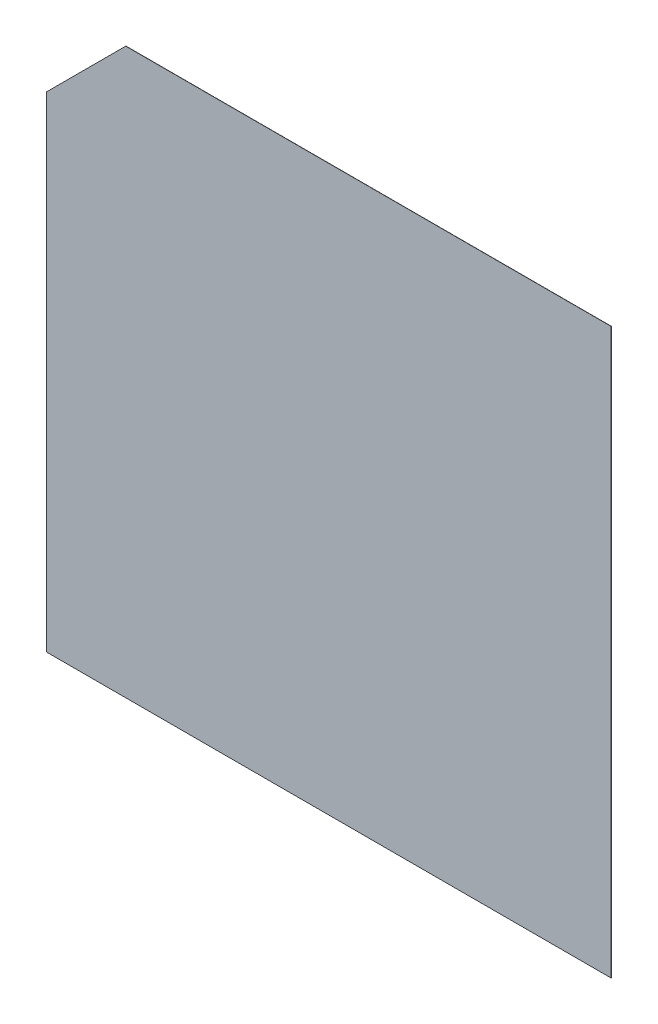
ISO-10303-21;
HEADER;
FILE_DESCRIPTION(('STEP AP214'),'2;1');
FILE_NAME('part.step','',(''),(''),'','','');
FILE_SCHEMA(('AUTOMOTIVE_DESIGN { 1 0 10303 214 1 1 1 1 }'));
ENDSEC;
DATA;
#1=APPLICATION_CONTEXT('core data for automotive mechanical design processes');
#2=APPLICATION_PROTOCOL_DEFINITION('international standard','automotive_design',2000,#1);
#3=PRODUCT_CONTEXT('',#1,'mechanical');
#4=PRODUCT('Part','Part','',(#3));
#5=PRODUCT_RELATED_PRODUCT_CATEGORY('part','',(#4));
#6=PRODUCT_DEFINITION_FORMATION('','',#4);
#7=PRODUCT_DEFINITION_CONTEXT('part definition',#1,'design');
#8=PRODUCT_DEFINITION('design','',#6,#7);
#9=PRODUCT_DEFINITION_SHAPE('','',#8);
#10=(LENGTH_UNIT() NAMED_UNIT(*) SI_UNIT(.MILLI.,.METRE.));
#11=(NAMED_UNIT(*) PLANE_ANGLE_UNIT() SI_UNIT($,.RADIAN.));
#12=(NAMED_UNIT(*) SI_UNIT($,.STERADIAN.) SOLID_ANGLE_UNIT());
#13=UNCERTAINTY_MEASURE_WITH_UNIT(LENGTH_MEASURE(1.E-05),#10,'distance_accuracy_value','');
#14=(GEOMETRIC_REPRESENTATION_CONTEXT(3) GLOBAL_UNCERTAINTY_ASSIGNED_CONTEXT((#13)) GLOBAL_UNIT_ASSIGNED_CONTEXT((#10,
#11,#12)) REPRESENTATION_CONTEXT('',''));
#15=CARTESIAN_POINT('',(0.,0.,0.));
#16=DIRECTION('',(0.,0.,1.));
#17=DIRECTION('',(1.,0.,0.));
#18=AXIS2_PLACEMENT_3D('',#15,#16,#17);
#19=CARTESIAN_POINT('',(0.,0.,0.001));
#20=DIRECTION('',(0.,0.,-1.));
#21=DIRECTION('',(-1.,0.,0.));
#22=AXIS2_PLACEMENT_3D('',#19,#20,#21);
#23=PLANE('',#22);
#24=DIRECTION('',(0.,1.,0.));
#25=VECTOR('',#24,1.);
#26=CARTESIAN_POINT('',(2.5,0.,0.001));
#27=LINE('',#26,#25);
#28=CARTESIAN_POINT('',(2.5,0.,0.001));
#29=VERTEX_POINT('',#28);
#30=CARTESIAN_POINT('',(2.5,2.5,0.001));
#31=VERTEX_POINT('',#30);
#32=EDGE_CURVE('E84',#29,#31,#27,.T.);
#33=ORIENTED_EDGE('',*,*,#32,.T.);
#34=DIRECTION('',(1.,0.,0.));
#35=VECTOR('',#34,1.);
#36=CARTESIAN_POINT('',(2.5,2.5,0.001));
#37=LINE('',#36,#35);
#38=CARTESIAN_POINT('',(0.35,2.5,0.001));
#39=VERTEX_POINT('',#38);
#40=EDGE_CURVE('E65',#31,#39,#37,.F.);
#41=ORIENTED_EDGE('',*,*,#40,.T.);
#42=DIRECTION('',(0.707106781186548,0.707106781186548,0.));
#43=VECTOR('',#42,1.);
#44=CARTESIAN_POINT('',(0.35,2.5,0.001));
#45=LINE('',#44,#43);
#46=CARTESIAN_POINT('',(0.,2.15,0.001));
#47=VERTEX_POINT('',#46);
#48=EDGE_CURVE('E59',#39,#47,#45,.F.);
#49=ORIENTED_EDGE('',*,*,#48,.T.);
#50=DIRECTION('',(0.,1.,0.));
#51=VECTOR('',#50,1.);
#52=CARTESIAN_POINT('',(0.,2.15,0.001));
#53=LINE('',#52,#51);
#54=CARTESIAN_POINT('',(0.,0.,0.001));
#55=VERTEX_POINT('',#54);
#56=EDGE_CURVE('E62',#47,#55,#53,.F.);
#57=ORIENTED_EDGE('',*,*,#56,.T.);
#58=DIRECTION('',(1.,0.,0.));
#59=VECTOR('',#58,1.);
#60=CARTESIAN_POINT('',(0.,0.,0.001));
#61=LINE('',#60,#59);
#62=EDGE_CURVE('E92',#55,#29,#61,.T.);
#63=ORIENTED_EDGE('',*,*,#62,.T.);
#64=EDGE_LOOP('',(#33,#41,#49,#57,#63));
#65=FACE_BOUND('',#64,.T.);
#66=ADVANCED_FACE('F16',(#65),#23,.F.);
#67=CARTESIAN_POINT('',(0.,2.15,0.));
#68=DIRECTION('',(1.,0.,0.));
#69=DIRECTION('',(0.,0.,-1.));
#70=AXIS2_PLACEMENT_3D('',#67,#68,#69);
#71=PLANE('',#70);
#72=DIRECTION('',(0.,0.,-1.));
#73=VECTOR('',#72,1.);
#74=CARTESIAN_POINT('',(0.,0.,0.));
#75=LINE('',#74,#73);
#76=CARTESIAN_POINT('',(0.,0.,0.));
#77=VERTEX_POINT('',#76);
#78=EDGE_CURVE('E75',#77,#55,#75,.F.);
#79=ORIENTED_EDGE('',*,*,#78,.T.);
#80=ORIENTED_EDGE('',*,*,#56,.F.);
#81=DIRECTION('',(0.,0.,-1.));
#82=VECTOR('',#81,1.);
#83=CARTESIAN_POINT('',(0.,2.15,0.));
#84=LINE('',#83,#82);
#85=CARTESIAN_POINT('',(0.,2.15,0.));
#86=VERTEX_POINT('',#85);
#87=EDGE_CURVE('E19',#47,#86,#84,.T.);
#88=ORIENTED_EDGE('',*,*,#87,.T.);
#89=DIRECTION('',(0.,1.,0.));
#90=VECTOR('',#89,1.);
#91=CARTESIAN_POINT('',(0.,0.,0.));
#92=LINE('',#91,#90);
#93=EDGE_CURVE('E89',#77,#86,#92,.T.);
#94=ORIENTED_EDGE('',*,*,#93,.F.);
#95=EDGE_LOOP('',(#79,#80,#88,#94));
#96=FACE_BOUND('',#95,.T.);
#97=ADVANCED_FACE('F72',(#96),#71,.F.);
#98=CARTESIAN_POINT('',(0.35,2.5,0.));
#99=DIRECTION('',(0.707106781186548,-0.707106781186548,0.));
#100=DIRECTION('',(0.707106781186548,0.707106781186548,0.));
#101=AXIS2_PLACEMENT_3D('',#98,#99,#100);
#102=PLANE('',#101);
#103=ORIENTED_EDGE('',*,*,#87,.F.);
#104=ORIENTED_EDGE('',*,*,#48,.F.);
#105=DIRECTION('',(0.,0.,1.));
#106=VECTOR('',#105,1.);
#107=CARTESIAN_POINT('',(0.35,2.5,0.));
#108=LINE('',#107,#106);
#109=CARTESIAN_POINT('',(0.35,2.5,0.));
#110=VERTEX_POINT('',#109);
#111=EDGE_CURVE('E82',#39,#110,#108,.F.);
#112=ORIENTED_EDGE('',*,*,#111,.T.);
#113=DIRECTION('',(0.707106781186547,0.707106781186548,0.));
#114=VECTOR('',#113,1.);
#115=CARTESIAN_POINT('',(0.,2.15,0.));
#116=LINE('',#115,#114);
#117=EDGE_CURVE('E80',#86,#110,#116,.T.);
#118=ORIENTED_EDGE('',*,*,#117,.F.);
#119=EDGE_LOOP('',(#103,#104,#112,#118));
#120=FACE_BOUND('',#119,.T.);
#121=ADVANCED_FACE('F78',(#120),#102,.F.);
#122=CARTESIAN_POINT('',(2.5,2.5,0.));
#123=DIRECTION('',(0.,-1.,0.));
#124=DIRECTION('',(0.,0.,-1.));
#125=AXIS2_PLACEMENT_3D('',#122,#123,#124);
#126=PLANE('',#125);
#127=ORIENTED_EDGE('',*,*,#111,.F.);
#128=ORIENTED_EDGE('',*,*,#40,.F.);
#129=DIRECTION('',(0.,0.,-1.));
#130=VECTOR('',#129,1.);
#131=CARTESIAN_POINT('',(2.5,2.5,0.));
#132=LINE('',#131,#130);
#133=CARTESIAN_POINT('',(2.5,2.5,0.));
#134=VERTEX_POINT('',#133);
#135=EDGE_CURVE('E94',#31,#134,#132,.T.);
#136=ORIENTED_EDGE('',*,*,#135,.T.);
#137=DIRECTION('',(-1.,0.,0.));
#138=VECTOR('',#137,1.);
#139=CARTESIAN_POINT('',(0.,2.5,0.));
#140=LINE('',#139,#138);
#141=EDGE_CURVE('E87',#110,#134,#140,.F.);
#142=ORIENTED_EDGE('',*,*,#141,.F.);
#143=EDGE_LOOP('',(#127,#128,#136,#142));
#144=FACE_BOUND('',#143,.T.);
#145=ADVANCED_FACE('F108',(#144),#126,.F.);
#146=CARTESIAN_POINT('',(2.5,0.,0.));
#147=DIRECTION('',(-1.,0.,0.));
#148=DIRECTION('',(0.,0.,1.));
#149=AXIS2_PLACEMENT_3D('',#146,#147,#148);
#150=PLANE('',#149);
#151=ORIENTED_EDGE('',*,*,#135,.F.);
#152=ORIENTED_EDGE('',*,*,#32,.F.);
#153=DIRECTION('',(0.,0.,1.));
#154=VECTOR('',#153,1.);
#155=CARTESIAN_POINT('',(2.5,0.,0.));
#156=LINE('',#155,#154);
#157=CARTESIAN_POINT('',(2.5,0.,0.));
#158=VERTEX_POINT('',#157);
#159=EDGE_CURVE('E34',#29,#158,#156,.F.);
#160=ORIENTED_EDGE('',*,*,#159,.T.);
#161=DIRECTION('',(0.,1.,0.));
#162=VECTOR('',#161,1.);
#163=CARTESIAN_POINT('',(2.5,0.,0.));
#164=LINE('',#163,#162);
#165=EDGE_CURVE('E25',#134,#158,#164,.F.);
#166=ORIENTED_EDGE('',*,*,#165,.F.);
#167=EDGE_LOOP('',(#151,#152,#160,#166));
#168=FACE_BOUND('',#167,.T.);
#169=ADVANCED_FACE('F103',(#168),#150,.F.);
#170=CARTESIAN_POINT('',(0.,0.,0.));
#171=DIRECTION('',(0.,1.,0.));
#172=DIRECTION('',(0.,0.,1.));
#173=AXIS2_PLACEMENT_3D('',#170,#171,#172);
#174=PLANE('',#173);
#175=ORIENTED_EDGE('',*,*,#159,.F.);
#176=ORIENTED_EDGE('',*,*,#62,.F.);
#177=ORIENTED_EDGE('',*,*,#78,.F.);
#178=DIRECTION('',(-1.,0.,0.));
#179=VECTOR('',#178,1.);
#180=CARTESIAN_POINT('',(0.,0.,0.));
#181=LINE('',#180,#179);
#182=EDGE_CURVE('E11',#158,#77,#181,.T.);
#183=ORIENTED_EDGE('',*,*,#182,.F.);
#184=EDGE_LOOP('',(#175,#176,#177,#183));
#185=FACE_BOUND('',#184,.T.);
#186=ADVANCED_FACE('F104',(#185),#174,.F.);
#187=CARTESIAN_POINT('',(0.,0.,0.));
#188=DIRECTION('',(0.,0.,-1.));
#189=DIRECTION('',(-1.,0.,0.));
#190=AXIS2_PLACEMENT_3D('',#187,#188,#189);
#191=PLANE('',#190);
#192=ORIENTED_EDGE('',*,*,#165,.T.);
#193=ORIENTED_EDGE('',*,*,#182,.T.);
#194=ORIENTED_EDGE('',*,*,#93,.T.);
#195=ORIENTED_EDGE('',*,*,#117,.T.);
#196=ORIENTED_EDGE('',*,*,#141,.T.);
#197=EDGE_LOOP('',(#192,#193,#194,#195,#196));
#198=FACE_BOUND('',#197,.T.);
#199=ADVANCED_FACE('F107',(#198),#191,.T.);
#200=CLOSED_SHELL('',(#66,#97,#121,#145,#169,#186,#199));
#201=MANIFOLD_SOLID_BREP('B1',#200);
#202=ADVANCED_BREP_SHAPE_REPRESENTATION('',(#18,#201),#14);
#203=SHAPE_DEFINITION_REPRESENTATION(#9,#202);
ENDSEC;
END-ISO-10303-21;
